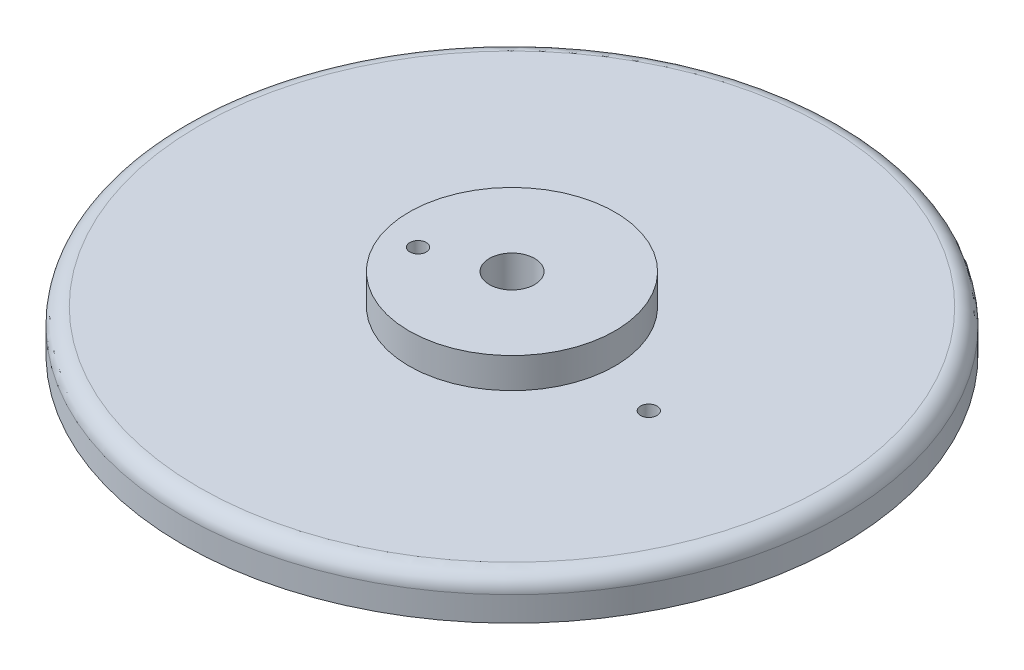
ISO-10303-21;
HEADER;
FILE_DESCRIPTION(('STEP AP214'),'2;1');
FILE_NAME('part.step','',(''),(''),'','','');
FILE_SCHEMA(('AUTOMOTIVE_DESIGN { 1 0 10303 214 1 1 1 1 }'));
ENDSEC;
DATA;
#1=APPLICATION_CONTEXT('core data for automotive mechanical design processes');
#2=APPLICATION_PROTOCOL_DEFINITION('international standard','automotive_design',2000,#1);
#3=PRODUCT_CONTEXT('',#1,'mechanical');
#4=PRODUCT('Part','Part','',(#3));
#5=PRODUCT_RELATED_PRODUCT_CATEGORY('part','',(#4));
#6=PRODUCT_DEFINITION_FORMATION('','',#4);
#7=PRODUCT_DEFINITION_CONTEXT('part definition',#1,'design');
#8=PRODUCT_DEFINITION('design','',#6,#7);
#9=PRODUCT_DEFINITION_SHAPE('','',#8);
#10=(LENGTH_UNIT() NAMED_UNIT(*) SI_UNIT(.MILLI.,.METRE.));
#11=(NAMED_UNIT(*) PLANE_ANGLE_UNIT() SI_UNIT($,.RADIAN.));
#12=(NAMED_UNIT(*) SI_UNIT($,.STERADIAN.) SOLID_ANGLE_UNIT());
#13=UNCERTAINTY_MEASURE_WITH_UNIT(LENGTH_MEASURE(1.E-05),#10,'distance_accuracy_value','');
#14=(GEOMETRIC_REPRESENTATION_CONTEXT(3) GLOBAL_UNCERTAINTY_ASSIGNED_CONTEXT((#13)) GLOBAL_UNIT_ASSIGNED_CONTEXT((#10,
#11,#12)) REPRESENTATION_CONTEXT('',''));
#15=CARTESIAN_POINT('',(0.,0.,0.));
#16=DIRECTION('',(0.,0.,1.));
#17=DIRECTION('',(1.,0.,0.));
#18=AXIS2_PLACEMENT_3D('',#15,#16,#17);
#19=CARTESIAN_POINT('',(0.,5.,0.));
#20=DIRECTION('',(0.,1.,0.));
#21=DIRECTION('',(0.,0.,1.));
#22=AXIS2_PLACEMENT_3D('',#19,#20,#21);
#23=PLANE('',#22);
#24=CARTESIAN_POINT('',(19.25,5.,2.65));
#25=DIRECTION('',(0.,1.,0.));
#26=DIRECTION('',(0.,0.,1.));
#27=AXIS2_PLACEMENT_3D('',#24,#25,#26);
#28=CIRCLE('',#27,1.);
#29=CARTESIAN_POINT('',(19.25,5.,3.65000000000001));
#30=VERTEX_POINT('',#29);
#31=EDGE_CURVE('E68',#30,#30,#28,.T.);
#32=ORIENTED_EDGE('',*,*,#31,.F.);
#33=EDGE_LOOP('',(#32));
#34=FACE_BOUND('',#33,.T.);
#35=CARTESIAN_POINT('',(0.,5.,0.));
#36=DIRECTION('',(0.,1.,0.));
#37=DIRECTION('',(0.,0.,1.));
#38=AXIS2_PLACEMENT_3D('',#35,#36,#37);
#39=CIRCLE('',#38,38.);
#40=CARTESIAN_POINT('',(0.,5.,38.));
#41=VERTEX_POINT('',#40);
#42=EDGE_CURVE('E42',#41,#41,#39,.T.);
#43=ORIENTED_EDGE('',*,*,#42,.T.);
#44=EDGE_LOOP('',(#43));
#45=FACE_BOUND('',#44,.T.);
#46=CARTESIAN_POINT('',(0.,5.,0.));
#47=DIRECTION('',(0.,1.,0.));
#48=DIRECTION('',(0.,0.,1.));
#49=AXIS2_PLACEMENT_3D('',#46,#47,#48);
#50=CIRCLE('',#49,12.5);
#51=CARTESIAN_POINT('',(0.,5.,12.5));
#52=VERTEX_POINT('',#51);
#53=EDGE_CURVE('E59',#52,#52,#50,.T.);
#54=ORIENTED_EDGE('',*,*,#53,.F.);
#55=EDGE_LOOP('',(#54));
#56=FACE_BOUND('',#55,.T.);
#57=ADVANCED_FACE('F40',(#34,#45,#56),#23,.T.);
#58=CARTESIAN_POINT('',(0.,0.,0.));
#59=DIRECTION('',(0.,1.,0.));
#60=DIRECTION('',(0.,0.,1.));
#61=AXIS2_PLACEMENT_3D('',#58,#59,#60);
#62=PLANE('',#61);
#63=CARTESIAN_POINT('',(-8.25,0.,3.15000000000001));
#64=DIRECTION('',(0.,1.,0.));
#65=DIRECTION('',(0.,0.,1.));
#66=AXIS2_PLACEMENT_3D('',#63,#64,#65);
#67=CIRCLE('',#66,1.);
#68=CARTESIAN_POINT('',(-8.25,0.,4.15000000000001));
#69=VERTEX_POINT('',#68);
#70=EDGE_CURVE('E69',#69,#69,#67,.T.);
#71=ORIENTED_EDGE('',*,*,#70,.T.);
#72=EDGE_LOOP('',(#71));
#73=FACE_BOUND('',#72,.T.);
#74=CARTESIAN_POINT('',(19.25,0.,2.65));
#75=DIRECTION('',(0.,1.,0.));
#76=DIRECTION('',(0.,0.,1.));
#77=AXIS2_PLACEMENT_3D('',#74,#75,#76);
#78=CIRCLE('',#77,1.);
#79=CARTESIAN_POINT('',(19.25,0.,3.65000000000001));
#80=VERTEX_POINT('',#79);
#81=EDGE_CURVE('E67',#80,#80,#78,.T.);
#82=ORIENTED_EDGE('',*,*,#81,.T.);
#83=EDGE_LOOP('',(#82));
#84=FACE_BOUND('',#83,.T.);
#85=CARTESIAN_POINT('',(0.,0.,0.));
#86=DIRECTION('',(0.,1.,0.));
#87=DIRECTION('',(0.,0.,1.));
#88=AXIS2_PLACEMENT_3D('',#85,#86,#87);
#89=CIRCLE('',#88,40.);
#90=CARTESIAN_POINT('',(0.,0.,40.));
#91=VERTEX_POINT('',#90);
#92=EDGE_CURVE('E48',#91,#91,#89,.T.);
#93=ORIENTED_EDGE('',*,*,#92,.F.);
#94=EDGE_LOOP('',(#93));
#95=FACE_BOUND('',#94,.T.);
#96=CARTESIAN_POINT('',(0.,0.,0.));
#97=DIRECTION('',(0.,1.,0.));
#98=DIRECTION('',(0.,0.,1.));
#99=AXIS2_PLACEMENT_3D('',#96,#97,#98);
#100=CIRCLE('',#99,2.75);
#101=CARTESIAN_POINT('',(0.,0.,2.75));
#102=VERTEX_POINT('',#101);
#103=EDGE_CURVE('E55',#102,#102,#100,.T.);
#104=ORIENTED_EDGE('',*,*,#103,.T.);
#105=EDGE_LOOP('',(#104));
#106=FACE_BOUND('',#105,.T.);
#107=ADVANCED_FACE('F76',(#73,#84,#95,#106),#62,.F.);
#108=CARTESIAN_POINT('',(0.,5.,0.));
#109=DIRECTION('',(0.,-1.,0.));
#110=DIRECTION('',(0.,0.,-1.));
#111=AXIS2_PLACEMENT_3D('',#108,#109,#110);
#112=CYLINDRICAL_SURFACE('',#111,40.);
#113=CARTESIAN_POINT('',(0.,3.,0.));
#114=DIRECTION('',(0.,1.,0.));
#115=DIRECTION('',(0.,0.,1.));
#116=AXIS2_PLACEMENT_3D('',#113,#114,#115);
#117=CIRCLE('',#116,40.);
#118=CARTESIAN_POINT('',(0.,3.,40.));
#119=VERTEX_POINT('',#118);
#120=EDGE_CURVE('E10',#119,#119,#117,.F.);
#121=ORIENTED_EDGE('',*,*,#120,.T.);
#122=EDGE_LOOP('',(#121));
#123=FACE_BOUND('',#122,.T.);
#124=ORIENTED_EDGE('',*,*,#92,.T.);
#125=EDGE_LOOP('',(#124));
#126=FACE_BOUND('',#125,.T.);
#127=ADVANCED_FACE('F99',(#123,#126),#112,.T.);
#128=CARTESIAN_POINT('',(0.,5.,0.));
#129=DIRECTION('',(0.,-1.,0.));
#130=DIRECTION('',(0.,0.,-1.));
#131=AXIS2_PLACEMENT_3D('',#128,#129,#130);
#132=CYLINDRICAL_SURFACE('',#131,2.75);
#133=ORIENTED_EDGE('',*,*,#103,.F.);
#134=EDGE_LOOP('',(#133));
#135=FACE_BOUND('',#134,.T.);
#136=CARTESIAN_POINT('',(0.,8.69,0.));
#137=DIRECTION('',(0.,1.,0.));
#138=DIRECTION('',(0.,0.,1.));
#139=AXIS2_PLACEMENT_3D('',#136,#137,#138);
#140=CIRCLE('',#139,2.75);
#141=CARTESIAN_POINT('',(0.,8.69,2.75));
#142=VERTEX_POINT('',#141);
#143=EDGE_CURVE('E62',#142,#142,#140,.T.);
#144=ORIENTED_EDGE('',*,*,#143,.T.);
#145=EDGE_LOOP('',(#144));
#146=FACE_BOUND('',#145,.T.);
#147=ADVANCED_FACE('F98',(#135,#146),#132,.F.);
#148=CARTESIAN_POINT('',(0.,3.,0.));
#149=DIRECTION('',(0.,1.,0.));
#150=DIRECTION('',(0.,0.,1.));
#151=AXIS2_PLACEMENT_3D('',#148,#149,#150);
#152=TOROIDAL_SURFACE('',#151,38.,2.);
#153=ORIENTED_EDGE('',*,*,#120,.F.);
#154=EDGE_LOOP('',(#153));
#155=FACE_BOUND('',#154,.T.);
#156=ORIENTED_EDGE('',*,*,#42,.F.);
#157=EDGE_LOOP('',(#156));
#158=FACE_BOUND('',#157,.T.);
#159=ADVANCED_FACE('F39',(#155,#158),#152,.T.);
#160=CARTESIAN_POINT('',(0.,8.69,0.));
#161=DIRECTION('',(0.,1.,0.));
#162=DIRECTION('',(0.,0.,1.));
#163=AXIS2_PLACEMENT_3D('',#160,#161,#162);
#164=PLANE('',#163);
#165=CARTESIAN_POINT('',(-8.25,8.69,3.15000000000001));
#166=DIRECTION('',(0.,1.,0.));
#167=DIRECTION('',(0.,0.,1.));
#168=AXIS2_PLACEMENT_3D('',#165,#166,#167);
#169=CIRCLE('',#168,1.);
#170=CARTESIAN_POINT('',(-8.25,8.69,4.15000000000001));
#171=VERTEX_POINT('',#170);
#172=EDGE_CURVE('E71',#171,#171,#169,.T.);
#173=ORIENTED_EDGE('',*,*,#172,.F.);
#174=EDGE_LOOP('',(#173));
#175=FACE_BOUND('',#174,.T.);
#176=CARTESIAN_POINT('',(0.,8.69,0.));
#177=DIRECTION('',(0.,1.,0.));
#178=DIRECTION('',(0.,0.,1.));
#179=AXIS2_PLACEMENT_3D('',#176,#177,#178);
#180=CIRCLE('',#179,12.5);
#181=CARTESIAN_POINT('',(0.,8.69,12.5));
#182=VERTEX_POINT('',#181);
#183=EDGE_CURVE('E60',#182,#182,#180,.T.);
#184=ORIENTED_EDGE('',*,*,#183,.T.);
#185=EDGE_LOOP('',(#184));
#186=FACE_BOUND('',#185,.T.);
#187=ORIENTED_EDGE('',*,*,#143,.F.);
#188=EDGE_LOOP('',(#187));
#189=FACE_BOUND('',#188,.T.);
#190=ADVANCED_FACE('F89',(#175,#186,#189),#164,.T.);
#191=CARTESIAN_POINT('',(0.,8.69,0.));
#192=DIRECTION('',(0.,-1.,0.));
#193=DIRECTION('',(0.,0.,-1.));
#194=AXIS2_PLACEMENT_3D('',#191,#192,#193);
#195=CYLINDRICAL_SURFACE('',#194,12.5);
#196=ORIENTED_EDGE('',*,*,#183,.F.);
#197=EDGE_LOOP('',(#196));
#198=FACE_BOUND('',#197,.T.);
#199=ORIENTED_EDGE('',*,*,#53,.T.);
#200=EDGE_LOOP('',(#199));
#201=FACE_BOUND('',#200,.T.);
#202=ADVANCED_FACE('F88',(#198,#201),#195,.T.);
#203=CARTESIAN_POINT('',(-8.25,0.,3.15000000000001));
#204=DIRECTION('',(0.,1.,0.));
#205=DIRECTION('',(0.,0.,1.));
#206=AXIS2_PLACEMENT_3D('',#203,#204,#205);
#207=CYLINDRICAL_SURFACE('',#206,1.);
#208=ORIENTED_EDGE('',*,*,#70,.F.);
#209=EDGE_LOOP('',(#208));
#210=FACE_BOUND('',#209,.T.);
#211=ORIENTED_EDGE('',*,*,#172,.T.);
#212=EDGE_LOOP('',(#211));
#213=FACE_BOUND('',#212,.T.);
#214=ADVANCED_FACE('F85',(#210,#213),#207,.F.);
#215=CARTESIAN_POINT('',(19.25,0.,2.65));
#216=DIRECTION('',(0.,1.,0.));
#217=DIRECTION('',(0.,0.,1.));
#218=AXIS2_PLACEMENT_3D('',#215,#216,#217);
#219=CYLINDRICAL_SURFACE('',#218,1.);
#220=ORIENTED_EDGE('',*,*,#31,.T.);
#221=EDGE_LOOP('',(#220));
#222=FACE_BOUND('',#221,.T.);
#223=ORIENTED_EDGE('',*,*,#81,.F.);
#224=EDGE_LOOP('',(#223));
#225=FACE_BOUND('',#224,.T.);
#226=ADVANCED_FACE('F82',(#222,#225),#219,.F.);
#227=CLOSED_SHELL('',(#57,#107,#127,#147,#159,#190,#202,#214,#226));
#228=MANIFOLD_SOLID_BREP('B2',#227);
#229=ADVANCED_BREP_SHAPE_REPRESENTATION('',(#18,#228),#14);
#230=SHAPE_DEFINITION_REPRESENTATION(#9,#229);
ENDSEC;
END-ISO-10303-21;
